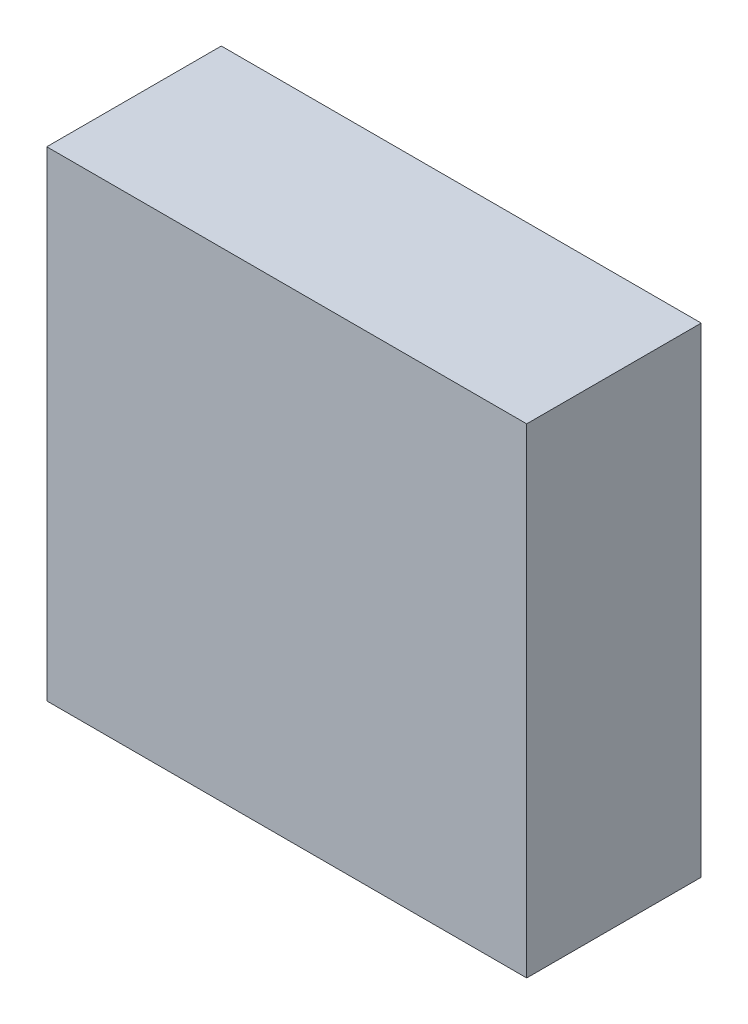
ISO-10303-21;
HEADER;
FILE_DESCRIPTION(('STEP AP214'),'2;1');
FILE_NAME('part.step','',(''),(''),'','','');
FILE_SCHEMA(('AUTOMOTIVE_DESIGN { 1 0 10303 214 1 1 1 1 }'));
ENDSEC;
DATA;
#1=APPLICATION_CONTEXT('core data for automotive mechanical design processes');
#2=APPLICATION_PROTOCOL_DEFINITION('international standard','automotive_design',2000,#1);
#3=PRODUCT_CONTEXT('',#1,'mechanical');
#4=PRODUCT('Part','Part','',(#3));
#5=PRODUCT_RELATED_PRODUCT_CATEGORY('part','',(#4));
#6=PRODUCT_DEFINITION_FORMATION('','',#4);
#7=PRODUCT_DEFINITION_CONTEXT('part definition',#1,'design');
#8=PRODUCT_DEFINITION('design','',#6,#7);
#9=PRODUCT_DEFINITION_SHAPE('','',#8);
#10=(LENGTH_UNIT() NAMED_UNIT(*) SI_UNIT(.MILLI.,.METRE.));
#11=(NAMED_UNIT(*) PLANE_ANGLE_UNIT() SI_UNIT($,.RADIAN.));
#12=(NAMED_UNIT(*) SI_UNIT($,.STERADIAN.) SOLID_ANGLE_UNIT());
#13=UNCERTAINTY_MEASURE_WITH_UNIT(LENGTH_MEASURE(1.E-05),#10,'distance_accuracy_value','');
#14=(GEOMETRIC_REPRESENTATION_CONTEXT(3) GLOBAL_UNCERTAINTY_ASSIGNED_CONTEXT((#13)) GLOBAL_UNIT_ASSIGNED_CONTEXT((#10,
#11,#12)) REPRESENTATION_CONTEXT('',''));
#15=CARTESIAN_POINT('',(0.,0.,0.));
#16=DIRECTION('',(0.,0.,1.));
#17=DIRECTION('',(1.,0.,0.));
#18=AXIS2_PLACEMENT_3D('',#15,#16,#17);
#19=CARTESIAN_POINT('',(0.,0.,0.80000094));
#20=DIRECTION('',(0.,0.,1.));
#21=DIRECTION('',(1.,0.,0.));
#22=AXIS2_PLACEMENT_3D('',#19,#20,#21);
#23=PLANE('',#22);
#24=DIRECTION('',(0.,1.,0.));
#25=VECTOR('',#24,1.);
#26=CARTESIAN_POINT('',(-1.10000034,-1.10000034,0.8000009396787));
#27=LINE('',#26,#25);
#28=CARTESIAN_POINT('',(-1.10000034,-1.10000034,0.8000009396787));
#29=VERTEX_POINT('',#28);
#30=CARTESIAN_POINT('',(-1.10000034,1.10000034,0.8000009396787));
#31=VERTEX_POINT('',#30);
#32=EDGE_CURVE('E11',#29,#31,#27,.T.);
#33=ORIENTED_EDGE('',*,*,#32,.F.);
#34=DIRECTION('',(-1.,0.,0.));
#35=VECTOR('',#34,1.);
#36=CARTESIAN_POINT('',(1.100000339707,-1.10000034,0.8000009396787));
#37=LINE('',#36,#35);
#38=CARTESIAN_POINT('',(1.100000339707,-1.10000034,0.8000009396787));
#39=VERTEX_POINT('',#38);
#40=EDGE_CURVE('E93',#39,#29,#37,.T.);
#41=ORIENTED_EDGE('',*,*,#40,.F.);
#42=DIRECTION('',(-1.333333031533E-10,-1.,0.));
#43=VECTOR('',#42,1.);
#44=CARTESIAN_POINT('',(1.10000034,1.10000034,0.8000009396787));
#45=LINE('',#44,#43);
#46=CARTESIAN_POINT('',(1.10000034,1.10000034,0.8000009396787));
#47=VERTEX_POINT('',#46);
#48=EDGE_CURVE('E79',#47,#39,#45,.T.);
#49=ORIENTED_EDGE('',*,*,#48,.F.);
#50=DIRECTION('',(1.,0.,0.));
#51=VECTOR('',#50,1.);
#52=CARTESIAN_POINT('',(-1.10000034,1.10000034,0.8000009396787));
#53=LINE('',#52,#51);
#54=EDGE_CURVE('E110',#31,#47,#53,.T.);
#55=ORIENTED_EDGE('',*,*,#54,.F.);
#56=EDGE_LOOP('',(#33,#41,#49,#55));
#57=FACE_BOUND('',#56,.T.);
#58=ADVANCED_FACE('F18',(#57),#23,.T.);
#59=CARTESIAN_POINT('',(-1.10000034,1.10000034,0.));
#60=DIRECTION('',(-1.,0.,0.));
#61=DIRECTION('',(0.,0.,1.));
#62=AXIS2_PLACEMENT_3D('',#59,#60,#61);
#63=PLANE('',#62);
#64=ORIENTED_EDGE('',*,*,#32,.T.);
#65=DIRECTION('',(-2.041664437459E-10,2.041664437459E-10,-1.));
#66=VECTOR('',#65,1.);
#67=CARTESIAN_POINT('',(-1.10000034,1.10000034,0.8000009396787));
#68=LINE('',#67,#66);
#69=CARTESIAN_POINT('',(-1.100000340163,1.100000340163,0.));
#70=VERTEX_POINT('',#69);
#71=EDGE_CURVE('E29',#31,#70,#68,.T.);
#72=ORIENTED_EDGE('',*,*,#71,.T.);
#73=DIRECTION('',(0.,1.,0.));
#74=VECTOR('',#73,1.);
#75=CARTESIAN_POINT('',(-1.100000340163,-1.100000340163,0.));
#76=LINE('',#75,#74);
#77=CARTESIAN_POINT('',(-1.100000340163,-1.100000340163,0.));
#78=VERTEX_POINT('',#77);
#79=EDGE_CURVE('E104',#78,#70,#76,.T.);
#80=ORIENTED_EDGE('',*,*,#79,.F.);
#81=DIRECTION('',(-2.041664437459E-10,-2.041664437459E-10,-1.));
#82=VECTOR('',#81,1.);
#83=CARTESIAN_POINT('',(-1.10000034,-1.10000034,0.8000009396787));
#84=LINE('',#83,#82);
#85=EDGE_CURVE('E84',#29,#78,#84,.T.);
#86=ORIENTED_EDGE('',*,*,#85,.F.);
#87=EDGE_LOOP('',(#64,#72,#80,#86));
#88=FACE_BOUND('',#87,.T.);
#89=ADVANCED_FACE('F122',(#88),#63,.T.);
#90=CARTESIAN_POINT('',(1.10000034,1.10000034,0.));
#91=DIRECTION('',(0.,1.,0.));
#92=DIRECTION('',(1.,0.,0.));
#93=AXIS2_PLACEMENT_3D('',#90,#91,#92);
#94=PLANE('',#93);
#95=ORIENTED_EDGE('',*,*,#54,.T.);
#96=DIRECTION('',(2.041664437459E-10,2.041664437459E-10,-1.));
#97=VECTOR('',#96,1.);
#98=CARTESIAN_POINT('',(1.10000034,1.10000034,0.8000009396787));
#99=LINE('',#98,#97);
#100=CARTESIAN_POINT('',(1.100000340163,1.100000340163,0.));
#101=VERTEX_POINT('',#100);
#102=EDGE_CURVE('E66',#47,#101,#99,.T.);
#103=ORIENTED_EDGE('',*,*,#102,.T.);
#104=DIRECTION('',(1.,0.,0.));
#105=VECTOR('',#104,1.);
#106=CARTESIAN_POINT('',(-1.100000340163,1.100000340163,0.));
#107=LINE('',#106,#105);
#108=EDGE_CURVE('E22',#70,#101,#107,.T.);
#109=ORIENTED_EDGE('',*,*,#108,.F.);
#110=ORIENTED_EDGE('',*,*,#71,.F.);
#111=EDGE_LOOP('',(#95,#103,#109,#110));
#112=FACE_BOUND('',#111,.T.);
#113=ADVANCED_FACE('F124',(#112),#94,.T.);
#114=CARTESIAN_POINT('',(1.10000034,-1.10000034,0.));
#115=DIRECTION('',(1.,0.,0.));
#116=DIRECTION('',(0.,1.,0.));
#117=AXIS2_PLACEMENT_3D('',#114,#115,#116);
#118=PLANE('',#117);
#119=ORIENTED_EDGE('',*,*,#48,.T.);
#120=DIRECTION('',(2.041664437459E-10,-2.041664437459E-10,-1.));
#121=VECTOR('',#120,1.);
#122=CARTESIAN_POINT('',(1.100000339707,-1.10000034,0.8000009396787));
#123=LINE('',#122,#121);
#124=CARTESIAN_POINT('',(1.10000033987,-1.100000340163,0.));
#125=VERTEX_POINT('',#124);
#126=EDGE_CURVE('E73',#39,#125,#123,.T.);
#127=ORIENTED_EDGE('',*,*,#126,.T.);
#128=DIRECTION('',(-1.333333031335E-10,-1.,0.));
#129=VECTOR('',#128,1.);
#130=CARTESIAN_POINT('',(1.100000340163,1.100000340163,0.));
#131=LINE('',#130,#129);
#132=EDGE_CURVE('E76',#101,#125,#131,.T.);
#133=ORIENTED_EDGE('',*,*,#132,.F.);
#134=ORIENTED_EDGE('',*,*,#102,.F.);
#135=EDGE_LOOP('',(#119,#127,#133,#134));
#136=FACE_BOUND('',#135,.T.);
#137=ADVANCED_FACE('F20',(#136),#118,.T.);
#138=CARTESIAN_POINT('',(-1.10000034,-1.10000034,0.));
#139=DIRECTION('',(0.,-1.,0.));
#140=DIRECTION('',(0.,0.,-1.));
#141=AXIS2_PLACEMENT_3D('',#138,#139,#140);
#142=PLANE('',#141);
#143=ORIENTED_EDGE('',*,*,#40,.T.);
#144=ORIENTED_EDGE('',*,*,#85,.T.);
#145=DIRECTION('',(-1.,0.,0.));
#146=VECTOR('',#145,1.);
#147=CARTESIAN_POINT('',(1.10000033987,-1.100000340163,0.));
#148=LINE('',#147,#146);
#149=EDGE_CURVE('E87',#125,#78,#148,.T.);
#150=ORIENTED_EDGE('',*,*,#149,.F.);
#151=ORIENTED_EDGE('',*,*,#126,.F.);
#152=EDGE_LOOP('',(#143,#144,#150,#151));
#153=FACE_BOUND('',#152,.T.);
#154=ADVANCED_FACE('F88',(#153),#142,.T.);
#155=CARTESIAN_POINT('',(0.,0.,0.));
#156=DIRECTION('',(0.,0.,1.));
#157=DIRECTION('',(1.,0.,0.));
#158=AXIS2_PLACEMENT_3D('',#155,#156,#157);
#159=PLANE('',#158);
#160=ORIENTED_EDGE('',*,*,#79,.T.);
#161=ORIENTED_EDGE('',*,*,#108,.T.);
#162=ORIENTED_EDGE('',*,*,#132,.T.);
#163=ORIENTED_EDGE('',*,*,#149,.T.);
#164=EDGE_LOOP('',(#160,#161,#162,#163));
#165=FACE_BOUND('',#164,.T.);
#166=ADVANCED_FACE('F95',(#165),#159,.F.);
#167=CLOSED_SHELL('',(#58,#89,#113,#137,#154,#166));
#168=MANIFOLD_SOLID_BREP('B1',#167);
#169=ADVANCED_BREP_SHAPE_REPRESENTATION('',(#18,#168),#14);
#170=SHAPE_DEFINITION_REPRESENTATION(#9,#169);
ENDSEC;
END-ISO-10303-21;
